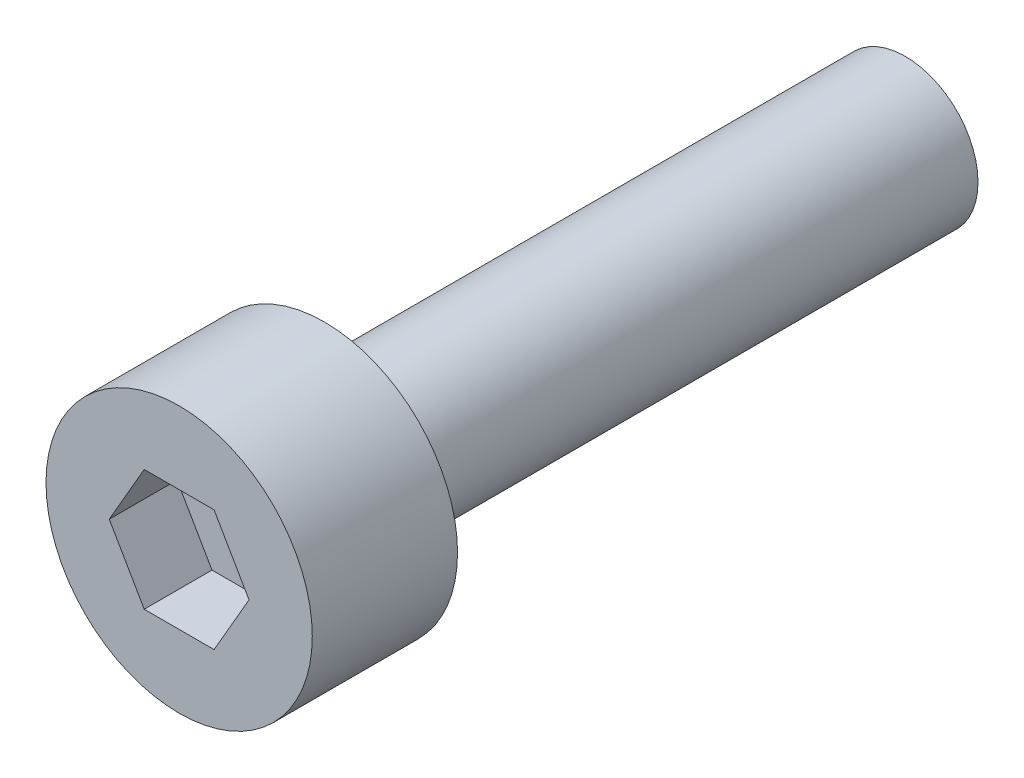
ISO-10303-21;
HEADER;
FILE_DESCRIPTION(('STEP AP214'),'2;1');
FILE_NAME('part.step','',(''),(''),'','','');
FILE_SCHEMA(('AUTOMOTIVE_DESIGN { 1 0 10303 214 1 1 1 1 }'));
ENDSEC;
DATA;
#1=APPLICATION_CONTEXT('core data for automotive mechanical design processes');
#2=APPLICATION_PROTOCOL_DEFINITION('international standard','automotive_design',2000,#1);
#3=PRODUCT_CONTEXT('',#1,'mechanical');
#4=PRODUCT('Part','Part','',(#3));
#5=PRODUCT_RELATED_PRODUCT_CATEGORY('part','',(#4));
#6=PRODUCT_DEFINITION_FORMATION('','',#4);
#7=PRODUCT_DEFINITION_CONTEXT('part definition',#1,'design');
#8=PRODUCT_DEFINITION('design','',#6,#7);
#9=PRODUCT_DEFINITION_SHAPE('','',#8);
#10=(LENGTH_UNIT() NAMED_UNIT(*) SI_UNIT(.MILLI.,.METRE.));
#11=(NAMED_UNIT(*) PLANE_ANGLE_UNIT() SI_UNIT($,.RADIAN.));
#12=(NAMED_UNIT(*) SI_UNIT($,.STERADIAN.) SOLID_ANGLE_UNIT());
#13=UNCERTAINTY_MEASURE_WITH_UNIT(LENGTH_MEASURE(1.E-05),#10,'distance_accuracy_value','');
#14=(GEOMETRIC_REPRESENTATION_CONTEXT(3) GLOBAL_UNCERTAINTY_ASSIGNED_CONTEXT((#13)) GLOBAL_UNIT_ASSIGNED_CONTEXT((#10,
#11,#12)) REPRESENTATION_CONTEXT('',''));
#15=CARTESIAN_POINT('',(0.,0.,0.));
#16=DIRECTION('',(0.,0.,1.));
#17=DIRECTION('',(1.,0.,0.));
#18=AXIS2_PLACEMENT_3D('',#15,#16,#17);
#19=CARTESIAN_POINT('',(0.,0.,3.));
#20=DIRECTION('',(0.,0.,1.));
#21=DIRECTION('',(1.,0.,0.));
#22=AXIS2_PLACEMENT_3D('',#19,#20,#21);
#23=PLANE('',#22);
#24=CARTESIAN_POINT('',(0.,0.,3.));
#25=DIRECTION('',(0.,0.,1.));
#26=DIRECTION('',(1.,0.,0.));
#27=AXIS2_PLACEMENT_3D('',#24,#25,#26);
#28=CIRCLE('',#27,2.75);
#29=CARTESIAN_POINT('',(2.75,0.,3.));
#30=VERTEX_POINT('',#29);
#31=EDGE_CURVE('E11',#30,#30,#28,.T.);
#32=ORIENTED_EDGE('',*,*,#31,.T.);
#33=EDGE_LOOP('',(#32));
#34=FACE_BOUND('',#33,.T.);
#35=DIRECTION('',(-0.5,0.866025403784439,0.));
#36=VECTOR('',#35,1.);
#37=CARTESIAN_POINT('',(1.44337567297406,0.,3.));
#38=LINE('',#37,#36);
#39=CARTESIAN_POINT('',(1.44337567297406,0.,3.));
#40=VERTEX_POINT('',#39);
#41=CARTESIAN_POINT('',(0.721687836487032,1.25,3.));
#42=VERTEX_POINT('',#41);
#43=EDGE_CURVE('E124',#40,#42,#38,.T.);
#44=ORIENTED_EDGE('',*,*,#43,.F.);
#45=DIRECTION('',(0.5,0.866025403784439,0.));
#46=VECTOR('',#45,1.);
#47=CARTESIAN_POINT('',(0.721687836487032,-1.25,3.));
#48=LINE('',#47,#46);
#49=CARTESIAN_POINT('',(0.721687836487032,-1.25,3.));
#50=VERTEX_POINT('',#49);
#51=EDGE_CURVE('E101',#50,#40,#48,.T.);
#52=ORIENTED_EDGE('',*,*,#51,.F.);
#53=DIRECTION('',(1.,0.,0.));
#54=VECTOR('',#53,1.);
#55=CARTESIAN_POINT('',(-0.721687836487033,-1.25,3.));
#56=LINE('',#55,#54);
#57=CARTESIAN_POINT('',(-0.721687836487033,-1.25,3.));
#58=VERTEX_POINT('',#57);
#59=EDGE_CURVE('E70',#58,#50,#56,.T.);
#60=ORIENTED_EDGE('',*,*,#59,.F.);
#61=DIRECTION('',(0.5,-0.866025403784439,0.));
#62=VECTOR('',#61,1.);
#63=CARTESIAN_POINT('',(-1.44337567297406,0.,3.));
#64=LINE('',#63,#62);
#65=CARTESIAN_POINT('',(-1.44337567297406,0.,3.));
#66=VERTEX_POINT('',#65);
#67=EDGE_CURVE('E135',#66,#58,#64,.T.);
#68=ORIENTED_EDGE('',*,*,#67,.F.);
#69=DIRECTION('',(-0.5,-0.866025403784439,0.));
#70=VECTOR('',#69,1.);
#71=CARTESIAN_POINT('',(-0.721687836487032,1.25,3.));
#72=LINE('',#71,#70);
#73=CARTESIAN_POINT('',(-0.721687836487032,1.25,3.));
#74=VERTEX_POINT('',#73);
#75=EDGE_CURVE('E122',#74,#66,#72,.T.);
#76=ORIENTED_EDGE('',*,*,#75,.F.);
#77=DIRECTION('',(-1.,0.,0.));
#78=VECTOR('',#77,1.);
#79=CARTESIAN_POINT('',(0.721687836487032,1.25,3.));
#80=LINE('',#79,#78);
#81=EDGE_CURVE('E109',#42,#74,#80,.T.);
#82=ORIENTED_EDGE('',*,*,#81,.F.);
#83=EDGE_LOOP('',(#44,#52,#60,#68,#76,#82));
#84=FACE_BOUND('',#83,.T.);
#85=ADVANCED_FACE('F50',(#34,#84),#23,.T.);
#86=CARTESIAN_POINT('',(0.,0.,3.));
#87=DIRECTION('',(0.,0.,-1.));
#88=DIRECTION('',(-1.,0.,0.));
#89=AXIS2_PLACEMENT_3D('',#86,#87,#88);
#90=CYLINDRICAL_SURFACE('',#89,2.75);
#91=ORIENTED_EDGE('',*,*,#31,.F.);
#92=EDGE_LOOP('',(#91));
#93=FACE_BOUND('',#92,.T.);
#94=CARTESIAN_POINT('',(0.,0.,0.));
#95=DIRECTION('',(0.,0.,1.));
#96=DIRECTION('',(1.,0.,0.));
#97=AXIS2_PLACEMENT_3D('',#94,#95,#96);
#98=CIRCLE('',#97,2.75);
#99=CARTESIAN_POINT('',(2.75,0.,0.));
#100=VERTEX_POINT('',#99);
#101=EDGE_CURVE('E51',#100,#100,#98,.T.);
#102=ORIENTED_EDGE('',*,*,#101,.T.);
#103=EDGE_LOOP('',(#102));
#104=FACE_BOUND('',#103,.T.);
#105=ADVANCED_FACE('F47',(#93,#104),#90,.T.);
#106=CARTESIAN_POINT('',(0.,0.,0.));
#107=DIRECTION('',(0.,0.,1.));
#108=DIRECTION('',(1.,0.,0.));
#109=AXIS2_PLACEMENT_3D('',#106,#107,#108);
#110=PLANE('',#109);
#111=CARTESIAN_POINT('',(0.,0.,0.));
#112=DIRECTION('',(0.,0.,1.));
#113=DIRECTION('',(1.,0.,0.));
#114=AXIS2_PLACEMENT_3D('',#111,#112,#113);
#115=CIRCLE('',#114,1.5);
#116=CARTESIAN_POINT('',(1.5,0.,0.));
#117=VERTEX_POINT('',#116);
#118=EDGE_CURVE('E156',#117,#117,#115,.T.);
#119=ORIENTED_EDGE('',*,*,#118,.T.);
#120=EDGE_LOOP('',(#119));
#121=FACE_BOUND('',#120,.T.);
#122=ORIENTED_EDGE('',*,*,#101,.F.);
#123=EDGE_LOOP('',(#122));
#124=FACE_BOUND('',#123,.T.);
#125=ADVANCED_FACE('F174',(#121,#124),#110,.F.);
#126=CARTESIAN_POINT('',(0.,0.,0.));
#127=DIRECTION('',(0.,0.,-1.));
#128=DIRECTION('',(-1.,0.,0.));
#129=AXIS2_PLACEMENT_3D('',#126,#127,#128);
#130=CYLINDRICAL_SURFACE('',#129,1.5);
#131=ORIENTED_EDGE('',*,*,#118,.F.);
#132=EDGE_LOOP('',(#131));
#133=FACE_BOUND('',#132,.T.);
#134=CARTESIAN_POINT('',(0.,0.,-12.));
#135=DIRECTION('',(0.,0.,1.));
#136=DIRECTION('',(1.,0.,0.));
#137=AXIS2_PLACEMENT_3D('',#134,#135,#136);
#138=CIRCLE('',#137,1.5);
#139=CARTESIAN_POINT('',(1.5,0.,-12.));
#140=VERTEX_POINT('',#139);
#141=EDGE_CURVE('E154',#140,#140,#138,.T.);
#142=ORIENTED_EDGE('',*,*,#141,.T.);
#143=EDGE_LOOP('',(#142));
#144=FACE_BOUND('',#143,.T.);
#145=ADVANCED_FACE('F165',(#133,#144),#130,.T.);
#146=CARTESIAN_POINT('',(0.,0.,-12.));
#147=DIRECTION('',(0.,0.,1.));
#148=DIRECTION('',(1.,0.,0.));
#149=AXIS2_PLACEMENT_3D('',#146,#147,#148);
#150=PLANE('',#149);
#151=ORIENTED_EDGE('',*,*,#141,.F.);
#152=EDGE_LOOP('',(#151));
#153=FACE_BOUND('',#152,.T.);
#154=ADVANCED_FACE('F163',(#153),#150,.F.);
#155=CARTESIAN_POINT('',(0.721687836487032,-1.25,3.));
#156=DIRECTION('',(-0.866025403784439,0.5,0.));
#157=DIRECTION('',(-0.5,-0.866025403784439,0.));
#158=AXIS2_PLACEMENT_3D('',#155,#156,#157);
#159=PLANE('',#158);
#160=DIRECTION('',(0.5,0.866025403784439,0.));
#161=VECTOR('',#160,1.);
#162=CARTESIAN_POINT('',(0.721687836487032,-1.25,1.6));
#163=LINE('',#162,#161);
#164=CARTESIAN_POINT('',(0.721687836487032,-1.25,1.6));
#165=VERTEX_POINT('',#164);
#166=CARTESIAN_POINT('',(1.44337567297406,0.,1.6));
#167=VERTEX_POINT('',#166);
#168=EDGE_CURVE('E136',#165,#167,#163,.T.);
#169=ORIENTED_EDGE('',*,*,#168,.F.);
#170=DIRECTION('',(0.,0.,-1.));
#171=VECTOR('',#170,1.);
#172=CARTESIAN_POINT('',(0.721687836487032,-1.25,3.));
#173=LINE('',#172,#171);
#174=EDGE_CURVE('E140',#50,#165,#173,.T.);
#175=ORIENTED_EDGE('',*,*,#174,.F.);
#176=ORIENTED_EDGE('',*,*,#51,.T.);
#177=DIRECTION('',(0.,0.,-1.));
#178=VECTOR('',#177,1.);
#179=CARTESIAN_POINT('',(1.44337567297406,0.,3.));
#180=LINE('',#179,#178);
#181=EDGE_CURVE('E153',#40,#167,#180,.T.);
#182=ORIENTED_EDGE('',*,*,#181,.T.);
#183=EDGE_LOOP('',(#169,#175,#176,#182));
#184=FACE_BOUND('',#183,.T.);
#185=ADVANCED_FACE('F167',(#184),#159,.T.);
#186=CARTESIAN_POINT('',(1.44337567297406,0.,3.));
#187=DIRECTION('',(-0.866025403784439,-0.5,0.));
#188=DIRECTION('',(0.5,-0.866025403784439,0.));
#189=AXIS2_PLACEMENT_3D('',#186,#187,#188);
#190=PLANE('',#189);
#191=DIRECTION('',(-0.5,0.866025403784439,0.));
#192=VECTOR('',#191,1.);
#193=CARTESIAN_POINT('',(1.44337567297406,0.,1.6));
#194=LINE('',#193,#192);
#195=CARTESIAN_POINT('',(0.721687836487032,1.25,1.6));
#196=VERTEX_POINT('',#195);
#197=EDGE_CURVE('E143',#167,#196,#194,.T.);
#198=ORIENTED_EDGE('',*,*,#197,.F.);
#199=ORIENTED_EDGE('',*,*,#181,.F.);
#200=ORIENTED_EDGE('',*,*,#43,.T.);
#201=DIRECTION('',(0.,0.,-1.));
#202=VECTOR('',#201,1.);
#203=CARTESIAN_POINT('',(0.721687836487032,1.25,3.));
#204=LINE('',#203,#202);
#205=EDGE_CURVE('E120',#42,#196,#204,.T.);
#206=ORIENTED_EDGE('',*,*,#205,.T.);
#207=EDGE_LOOP('',(#198,#199,#200,#206));
#208=FACE_BOUND('',#207,.T.);
#209=ADVANCED_FACE('F175',(#208),#190,.T.);
#210=CARTESIAN_POINT('',(0.721687836487032,1.25,3.));
#211=DIRECTION('',(0.,-1.,0.));
#212=DIRECTION('',(1.,0.,0.));
#213=AXIS2_PLACEMENT_3D('',#210,#211,#212);
#214=PLANE('',#213);
#215=DIRECTION('',(-1.,0.,0.));
#216=VECTOR('',#215,1.);
#217=CARTESIAN_POINT('',(0.721687836487032,1.25,1.6));
#218=LINE('',#217,#216);
#219=CARTESIAN_POINT('',(-0.721687836487032,1.25,1.6));
#220=VERTEX_POINT('',#219);
#221=EDGE_CURVE('E141',#196,#220,#218,.T.);
#222=ORIENTED_EDGE('',*,*,#221,.F.);
#223=ORIENTED_EDGE('',*,*,#205,.F.);
#224=ORIENTED_EDGE('',*,*,#81,.T.);
#225=DIRECTION('',(0.,0.,-1.));
#226=VECTOR('',#225,1.);
#227=CARTESIAN_POINT('',(-0.721687836487032,1.25,3.));
#228=LINE('',#227,#226);
#229=EDGE_CURVE('E111',#74,#220,#228,.T.);
#230=ORIENTED_EDGE('',*,*,#229,.T.);
#231=EDGE_LOOP('',(#222,#223,#224,#230));
#232=FACE_BOUND('',#231,.T.);
#233=ADVANCED_FACE('F114',(#232),#214,.T.);
#234=CARTESIAN_POINT('',(-0.721687836487032,1.25,3.));
#235=DIRECTION('',(0.866025403784438,-0.5,0.));
#236=DIRECTION('',(0.5,0.866025403784439,0.));
#237=AXIS2_PLACEMENT_3D('',#234,#235,#236);
#238=PLANE('',#237);
#239=DIRECTION('',(-0.5,-0.866025403784439,0.));
#240=VECTOR('',#239,1.);
#241=CARTESIAN_POINT('',(-0.721687836487032,1.25,1.6));
#242=LINE('',#241,#240);
#243=CARTESIAN_POINT('',(-1.44337567297406,0.,1.6));
#244=VERTEX_POINT('',#243);
#245=EDGE_CURVE('E126',#220,#244,#242,.T.);
#246=ORIENTED_EDGE('',*,*,#245,.F.);
#247=ORIENTED_EDGE('',*,*,#229,.F.);
#248=ORIENTED_EDGE('',*,*,#75,.T.);
#249=DIRECTION('',(0.,0.,-1.));
#250=VECTOR('',#249,1.);
#251=CARTESIAN_POINT('',(-1.44337567297406,0.,3.));
#252=LINE('',#251,#250);
#253=EDGE_CURVE('E129',#66,#244,#252,.T.);
#254=ORIENTED_EDGE('',*,*,#253,.T.);
#255=EDGE_LOOP('',(#246,#247,#248,#254));
#256=FACE_BOUND('',#255,.T.);
#257=ADVANCED_FACE('F123',(#256),#238,.T.);
#258=CARTESIAN_POINT('',(-1.44337567297406,0.,3.));
#259=DIRECTION('',(0.866025403784439,0.5,0.));
#260=DIRECTION('',(-0.5,0.866025403784439,0.));
#261=AXIS2_PLACEMENT_3D('',#258,#259,#260);
#262=PLANE('',#261);
#263=DIRECTION('',(0.5,-0.866025403784439,0.));
#264=VECTOR('',#263,1.);
#265=CARTESIAN_POINT('',(-1.44337567297406,0.,1.6));
#266=LINE('',#265,#264);
#267=CARTESIAN_POINT('',(-0.721687836487033,-1.25,1.6));
#268=VERTEX_POINT('',#267);
#269=EDGE_CURVE('E148',#244,#268,#266,.T.);
#270=ORIENTED_EDGE('',*,*,#269,.F.);
#271=ORIENTED_EDGE('',*,*,#253,.F.);
#272=ORIENTED_EDGE('',*,*,#67,.T.);
#273=DIRECTION('',(0.,0.,-1.));
#274=VECTOR('',#273,1.);
#275=CARTESIAN_POINT('',(-0.721687836487033,-1.25,3.));
#276=LINE('',#275,#274);
#277=EDGE_CURVE('E65',#58,#268,#276,.T.);
#278=ORIENTED_EDGE('',*,*,#277,.T.);
#279=EDGE_LOOP('',(#270,#271,#272,#278));
#280=FACE_BOUND('',#279,.T.);
#281=ADVANCED_FACE('F277',(#280),#262,.T.);
#282=CARTESIAN_POINT('',(-0.721687836487033,-1.25,3.));
#283=DIRECTION('',(0.,1.,0.));
#284=DIRECTION('',(-1.,0.,0.));
#285=AXIS2_PLACEMENT_3D('',#282,#283,#284);
#286=PLANE('',#285);
#287=DIRECTION('',(1.,0.,0.));
#288=VECTOR('',#287,1.);
#289=CARTESIAN_POINT('',(-0.721687836487033,-1.25,1.6));
#290=LINE('',#289,#288);
#291=EDGE_CURVE('E94',#268,#165,#290,.T.);
#292=ORIENTED_EDGE('',*,*,#291,.F.);
#293=ORIENTED_EDGE('',*,*,#277,.F.);
#294=ORIENTED_EDGE('',*,*,#59,.T.);
#295=ORIENTED_EDGE('',*,*,#174,.T.);
#296=EDGE_LOOP('',(#292,#293,#294,#295));
#297=FACE_BOUND('',#296,.T.);
#298=ADVANCED_FACE('F282',(#297),#286,.T.);
#299=CARTESIAN_POINT('',(0.,0.,1.6));
#300=DIRECTION('',(0.,0.,1.));
#301=DIRECTION('',(1.,0.,0.));
#302=AXIS2_PLACEMENT_3D('',#299,#300,#301);
#303=PLANE('',#302);
#304=ORIENTED_EDGE('',*,*,#168,.T.);
#305=ORIENTED_EDGE('',*,*,#197,.T.);
#306=ORIENTED_EDGE('',*,*,#221,.T.);
#307=ORIENTED_EDGE('',*,*,#245,.T.);
#308=ORIENTED_EDGE('',*,*,#269,.T.);
#309=ORIENTED_EDGE('',*,*,#291,.T.);
#310=EDGE_LOOP('',(#304,#305,#306,#307,#308,#309));
#311=FACE_BOUND('',#310,.T.);
#312=ADVANCED_FACE('F293',(#311),#303,.T.);
#313=CLOSED_SHELL('',(#85,#105,#125,#145,#154,#185,#209,#233,#257,#281,#298,#312));
#314=MANIFOLD_SOLID_BREP('B2',#313);
#315=ADVANCED_BREP_SHAPE_REPRESENTATION('',(#18,#314),#14);
#316=SHAPE_DEFINITION_REPRESENTATION(#9,#315);
ENDSEC;
END-ISO-10303-21;
